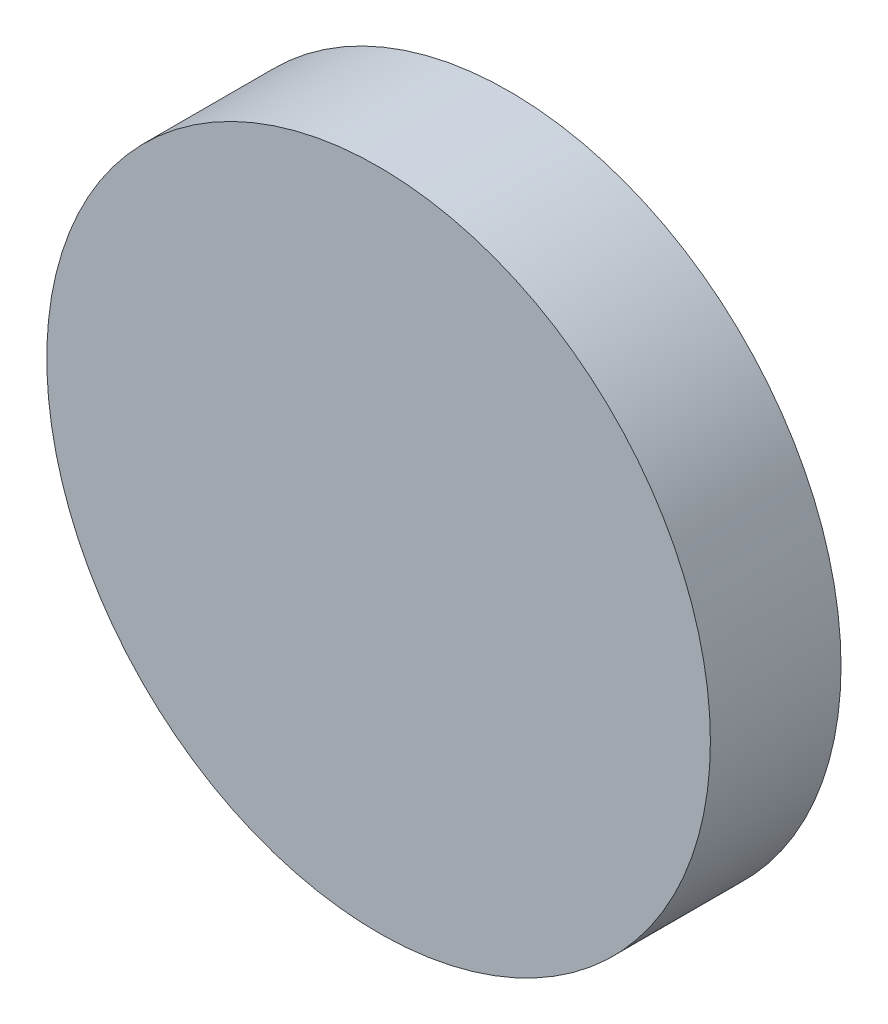
ISO-10303-21;
HEADER;
FILE_DESCRIPTION(('STEP AP214'),'2;1');
FILE_NAME('part.step','',(''),(''),'','','');
FILE_SCHEMA(('AUTOMOTIVE_DESIGN { 1 0 10303 214 1 1 1 1 }'));
ENDSEC;
DATA;
#1=APPLICATION_CONTEXT('core data for automotive mechanical design processes');
#2=APPLICATION_PROTOCOL_DEFINITION('international standard','automotive_design',2000,#1);
#3=PRODUCT_CONTEXT('',#1,'mechanical');
#4=PRODUCT('Part','Part','',(#3));
#5=PRODUCT_RELATED_PRODUCT_CATEGORY('part','',(#4));
#6=PRODUCT_DEFINITION_FORMATION('','',#4);
#7=PRODUCT_DEFINITION_CONTEXT('part definition',#1,'design');
#8=PRODUCT_DEFINITION('design','',#6,#7);
#9=PRODUCT_DEFINITION_SHAPE('','',#8);
#10=(LENGTH_UNIT() NAMED_UNIT(*) SI_UNIT(.MILLI.,.METRE.));
#11=(NAMED_UNIT(*) PLANE_ANGLE_UNIT() SI_UNIT($,.RADIAN.));
#12=(NAMED_UNIT(*) SI_UNIT($,.STERADIAN.) SOLID_ANGLE_UNIT());
#13=UNCERTAINTY_MEASURE_WITH_UNIT(LENGTH_MEASURE(1.E-05),#10,'distance_accuracy_value','');
#14=(GEOMETRIC_REPRESENTATION_CONTEXT(3) GLOBAL_UNCERTAINTY_ASSIGNED_CONTEXT((#13)) GLOBAL_UNIT_ASSIGNED_CONTEXT((#10,
#11,#12)) REPRESENTATION_CONTEXT('',''));
#15=CARTESIAN_POINT('',(0.,0.,0.));
#16=DIRECTION('',(0.,0.,1.));
#17=DIRECTION('',(1.,0.,0.));
#18=AXIS2_PLACEMENT_3D('',#15,#16,#17);
#19=CARTESIAN_POINT('',(0.,0.,15.));
#20=DIRECTION('',(0.,0.,1.));
#21=DIRECTION('',(1.,0.,0.));
#22=AXIS2_PLACEMENT_3D('',#19,#20,#21);
#23=CYLINDRICAL_SURFACE('',#22,1.49999999999999);
#24=CARTESIAN_POINT('',(0.,0.,0.));
#25=DIRECTION('',(0.,0.,1.));
#26=DIRECTION('',(1.,0.,0.));
#27=AXIS2_PLACEMENT_3D('',#24,#25,#26);
#28=CIRCLE('',#27,1.5);
#29=CARTESIAN_POINT('',(1.5,0.,0.));
#30=VERTEX_POINT('',#29);
#31=EDGE_CURVE('E56',#30,#30,#28,.T.);
#32=ORIENTED_EDGE('',*,*,#31,.F.);
#33=EDGE_LOOP('',(#32));
#34=FACE_BOUND('',#33,.T.);
#35=CARTESIAN_POINT('',(0.,0.,10.));
#36=DIRECTION('',(0.,0.,1.));
#37=DIRECTION('',(1.,0.,0.));
#38=AXIS2_PLACEMENT_3D('',#35,#36,#37);
#39=CIRCLE('',#38,1.49999999999999);
#40=CARTESIAN_POINT('',(1.49999999999999,0.,10.));
#41=VERTEX_POINT('',#40);
#42=EDGE_CURVE('E10',#41,#41,#39,.F.);
#43=ORIENTED_EDGE('',*,*,#42,.F.);
#44=EDGE_LOOP('',(#43));
#45=FACE_BOUND('',#44,.T.);
#46=ADVANCED_FACE('F34',(#34,#45),#23,.F.);
#47=CARTESIAN_POINT('',(0.,0.,15.));
#48=DIRECTION('',(0.,0.,-1.));
#49=DIRECTION('',(-1.,0.,0.));
#50=AXIS2_PLACEMENT_3D('',#47,#48,#49);
#51=CYLINDRICAL_SURFACE('',#50,38.1);
#52=CARTESIAN_POINT('',(0.,0.,15.));
#53=DIRECTION('',(0.,0.,1.));
#54=DIRECTION('',(1.,0.,0.));
#55=AXIS2_PLACEMENT_3D('',#52,#53,#54);
#56=CIRCLE('',#55,38.1);
#57=CARTESIAN_POINT('',(38.1,0.,15.));
#58=VERTEX_POINT('',#57);
#59=EDGE_CURVE('E43',#58,#58,#56,.T.);
#60=ORIENTED_EDGE('',*,*,#59,.F.);
#61=EDGE_LOOP('',(#60));
#62=FACE_BOUND('',#61,.T.);
#63=CARTESIAN_POINT('',(0.,0.,0.));
#64=DIRECTION('',(0.,0.,1.));
#65=DIRECTION('',(1.,0.,0.));
#66=AXIS2_PLACEMENT_3D('',#63,#64,#65);
#67=CIRCLE('',#66,38.1);
#68=CARTESIAN_POINT('',(38.1,0.,0.));
#69=VERTEX_POINT('',#68);
#70=EDGE_CURVE('E48',#69,#69,#67,.T.);
#71=ORIENTED_EDGE('',*,*,#70,.T.);
#72=EDGE_LOOP('',(#71));
#73=FACE_BOUND('',#72,.T.);
#74=ADVANCED_FACE('F36',(#62,#73),#51,.T.);
#75=CARTESIAN_POINT('',(0.,0.,15.));
#76=DIRECTION('',(0.,0.,1.));
#77=DIRECTION('',(1.,0.,0.));
#78=AXIS2_PLACEMENT_3D('',#75,#76,#77);
#79=PLANE('',#78);
#80=ORIENTED_EDGE('',*,*,#59,.T.);
#81=EDGE_LOOP('',(#80));
#82=FACE_BOUND('',#81,.T.);
#83=ADVANCED_FACE('F68',(#82),#79,.T.);
#84=CARTESIAN_POINT('',(0.,0.,0.));
#85=DIRECTION('',(0.,0.,1.));
#86=DIRECTION('',(1.,0.,0.));
#87=AXIS2_PLACEMENT_3D('',#84,#85,#86);
#88=PLANE('',#87);
#89=ORIENTED_EDGE('',*,*,#31,.T.);
#90=EDGE_LOOP('',(#89));
#91=FACE_BOUND('',#90,.T.);
#92=ORIENTED_EDGE('',*,*,#70,.F.);
#93=EDGE_LOOP('',(#92));
#94=FACE_BOUND('',#93,.T.);
#95=ADVANCED_FACE('F65',(#91,#94),#88,.F.);
#96=CARTESIAN_POINT('',(0.,0.,10.));
#97=DIRECTION('',(0.,0.,1.));
#98=DIRECTION('',(1.,0.,0.));
#99=AXIS2_PLACEMENT_3D('',#96,#97,#98);
#100=PLANE('',#99);
#101=ORIENTED_EDGE('',*,*,#42,.T.);
#102=EDGE_LOOP('',(#101));
#103=FACE_BOUND('',#102,.T.);
#104=ADVANCED_FACE('F67',(#103),#100,.F.);
#105=CLOSED_SHELL('',(#46,#74,#83,#95,#104));
#106=CARTESIAN_POINT('',(0.,0.,15.));
#107=DIRECTION('',(0.,0.,-1.));
#108=DIRECTION('',(-1.,0.,0.));
#109=AXIS2_PLACEMENT_3D('',#106,#107,#108);
#110=CYLINDRICAL_SURFACE('',#109,33.1);
#111=CARTESIAN_POINT('',(0.,0.,5.));
#112=DIRECTION('',(0.,0.,1.));
#113=DIRECTION('',(1.,0.,0.));
#114=AXIS2_PLACEMENT_3D('',#111,#112,#113);
#115=CIRCLE('',#114,33.1);
#116=CARTESIAN_POINT('',(33.1,0.,5.));
#117=VERTEX_POINT('',#116);
#118=EDGE_CURVE('E53',#117,#117,#115,.T.);
#119=ORIENTED_EDGE('',*,*,#118,.F.);
#120=EDGE_LOOP('',(#119));
#121=FACE_BOUND('',#120,.T.);
#122=CARTESIAN_POINT('',(0.,0.,10.));
#123=DIRECTION('',(0.,0.,1.));
#124=DIRECTION('',(1.,0.,0.));
#125=AXIS2_PLACEMENT_3D('',#122,#123,#124);
#126=CIRCLE('',#125,33.1);
#127=CARTESIAN_POINT('',(33.1,0.,10.));
#128=VERTEX_POINT('',#127);
#129=EDGE_CURVE('E52',#128,#128,#126,.T.);
#130=ORIENTED_EDGE('',*,*,#129,.T.);
#131=EDGE_LOOP('',(#130));
#132=FACE_BOUND('',#131,.T.);
#133=ADVANCED_FACE('F96',(#121,#132),#110,.F.);
#134=CARTESIAN_POINT('',(0.,0.,5.));
#135=DIRECTION('',(0.,0.,1.));
#136=DIRECTION('',(1.,0.,0.));
#137=AXIS2_PLACEMENT_3D('',#134,#135,#136);
#138=PLANE('',#137);
#139=CARTESIAN_POINT('',(0.,0.,5.));
#140=DIRECTION('',(0.,0.,1.));
#141=DIRECTION('',(1.,0.,0.));
#142=AXIS2_PLACEMENT_3D('',#139,#140,#141);
#143=CIRCLE('',#142,6.49999999999999);
#144=CARTESIAN_POINT('',(6.49999999999999,0.,5.));
#145=VERTEX_POINT('',#144);
#146=EDGE_CURVE('E57',#145,#145,#143,.T.);
#147=ORIENTED_EDGE('',*,*,#146,.F.);
#148=EDGE_LOOP('',(#147));
#149=FACE_BOUND('',#148,.T.);
#150=ORIENTED_EDGE('',*,*,#118,.T.);
#151=EDGE_LOOP('',(#150));
#152=FACE_BOUND('',#151,.T.);
#153=ADVANCED_FACE('F91',(#149,#152),#138,.T.);
#154=CARTESIAN_POINT('',(0.,0.,15.));
#155=DIRECTION('',(0.,0.,1.));
#156=DIRECTION('',(1.,0.,0.));
#157=AXIS2_PLACEMENT_3D('',#154,#155,#156);
#158=CYLINDRICAL_SURFACE('',#157,6.49999999999999);
#159=ORIENTED_EDGE('',*,*,#146,.T.);
#160=EDGE_LOOP('',(#159));
#161=FACE_BOUND('',#160,.T.);
#162=CARTESIAN_POINT('',(0.,0.,10.));
#163=DIRECTION('',(0.,0.,1.));
#164=DIRECTION('',(1.,0.,0.));
#165=AXIS2_PLACEMENT_3D('',#162,#163,#164);
#166=CIRCLE('',#165,6.49999999999999);
#167=CARTESIAN_POINT('',(6.49999999999999,0.,10.));
#168=VERTEX_POINT('',#167);
#169=EDGE_CURVE('E38',#168,#168,#166,.F.);
#170=ORIENTED_EDGE('',*,*,#169,.T.);
#171=EDGE_LOOP('',(#170));
#172=FACE_BOUND('',#171,.T.);
#173=ADVANCED_FACE('F88',(#161,#172),#158,.T.);
#174=ORIENTED_EDGE('',*,*,#129,.F.);
#175=EDGE_LOOP('',(#174));
#176=FACE_BOUND('',#175,.T.);
#177=ORIENTED_EDGE('',*,*,#169,.F.);
#178=EDGE_LOOP('',(#177));
#179=FACE_BOUND('',#178,.T.);
#180=ADVANCED_FACE('F75',(#176,#179),#100,.F.);
#181=CLOSED_SHELL('',(#133,#153,#173,#180));
#182=ORIENTED_CLOSED_SHELL('',*,#181,.T.);
#183=BREP_WITH_VOIDS('B2',#105,(#182));
#184=ADVANCED_BREP_SHAPE_REPRESENTATION('',(#18,#183),#14);
#185=SHAPE_DEFINITION_REPRESENTATION(#9,#184);
ENDSEC;
END-ISO-10303-21;
